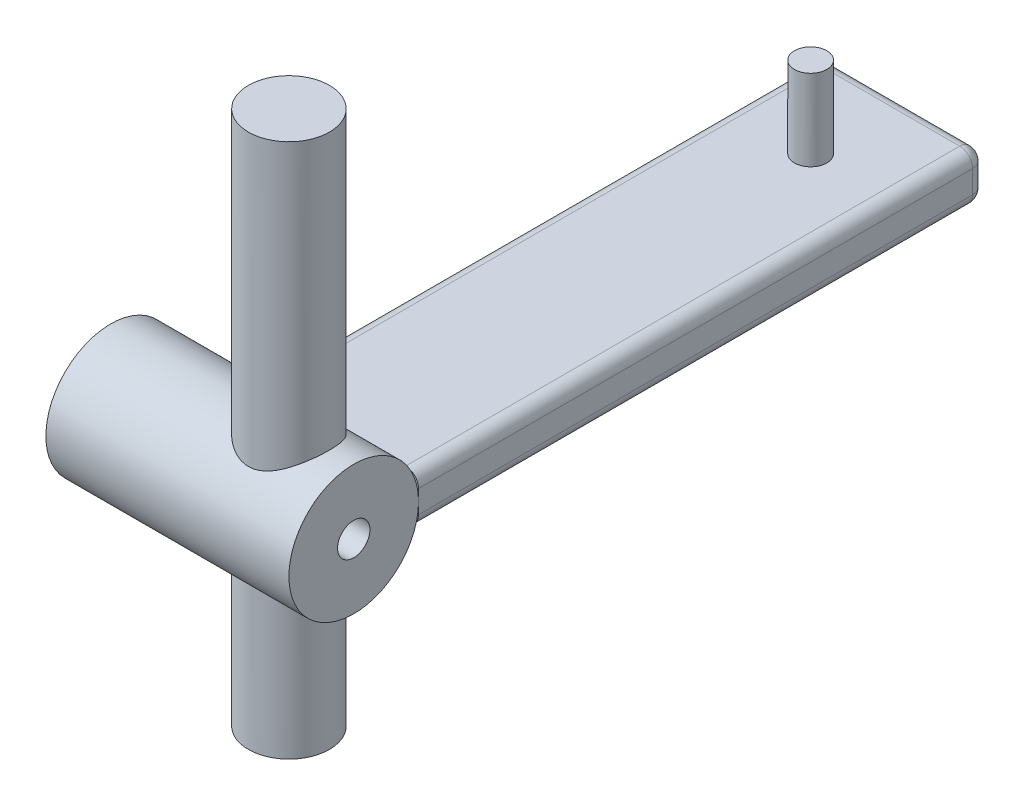
ISO-10303-21;
HEADER;
FILE_DESCRIPTION(('STEP AP214'),'2;1');
FILE_NAME('part.step','',(''),(''),'','','');
FILE_SCHEMA(('AUTOMOTIVE_DESIGN { 1 0 10303 214 1 1 1 1 }'));
ENDSEC;
DATA;
#1=APPLICATION_CONTEXT('core data for automotive mechanical design processes');
#2=APPLICATION_PROTOCOL_DEFINITION('international standard','automotive_design',2000,#1);
#3=PRODUCT_CONTEXT('',#1,'mechanical');
#4=PRODUCT('Part','Part','',(#3));
#5=PRODUCT_RELATED_PRODUCT_CATEGORY('part','',(#4));
#6=PRODUCT_DEFINITION_FORMATION('','',#4);
#7=PRODUCT_DEFINITION_CONTEXT('part definition',#1,'design');
#8=PRODUCT_DEFINITION('design','',#6,#7);
#9=PRODUCT_DEFINITION_SHAPE('','',#8);
#10=(LENGTH_UNIT() NAMED_UNIT(*) SI_UNIT(.MILLI.,.METRE.));
#11=(NAMED_UNIT(*) PLANE_ANGLE_UNIT() SI_UNIT($,.RADIAN.));
#12=(NAMED_UNIT(*) SI_UNIT($,.STERADIAN.) SOLID_ANGLE_UNIT());
#13=UNCERTAINTY_MEASURE_WITH_UNIT(LENGTH_MEASURE(1.E-05),#10,'distance_accuracy_value','');
#14=(GEOMETRIC_REPRESENTATION_CONTEXT(3) GLOBAL_UNCERTAINTY_ASSIGNED_CONTEXT((#13)) GLOBAL_UNIT_ASSIGNED_CONTEXT((#10,
#11,#12)) REPRESENTATION_CONTEXT('',''));
#15=CARTESIAN_POINT('',(0.,0.,0.));
#16=DIRECTION('',(0.,0.,1.));
#17=DIRECTION('',(1.,0.,0.));
#18=AXIS2_PLACEMENT_3D('',#15,#16,#17);
#19=CARTESIAN_POINT('',(5.,1.5,-39.));
#20=DIRECTION('',(0.,-1.,0.));
#21=DIRECTION('',(1.,0.,0.));
#22=AXIS2_PLACEMENT_3D('',#19,#20,#21);
#23=PLANE('',#22);
#24=CARTESIAN_POINT('',(10.,1.5,-33.2));
#25=DIRECTION('',(0.,-1.,0.));
#26=DIRECTION('',(1.,0.,0.));
#27=AXIS2_PLACEMENT_3D('',#24,#25,#26);
#28=CIRCLE('',#27,1.);
#29=CARTESIAN_POINT('',(11.,1.5,-33.2));
#30=VERTEX_POINT('',#29);
#31=EDGE_CURVE('E12',#30,#30,#28,.F.);
#32=ORIENTED_EDGE('',*,*,#31,.F.);
#33=EDGE_LOOP('',(#32));
#34=FACE_BOUND('',#33,.T.);
#35=DIRECTION('',(1.,0.,0.));
#36=VECTOR('',#35,1.);
#37=CARTESIAN_POINT('',(5.,1.5,-4.));
#38=LINE('',#37,#36);
#39=CARTESIAN_POINT('',(5.8,1.5,-4.));
#40=VERTEX_POINT('',#39);
#41=CARTESIAN_POINT('',(14.2,1.5,-4.));
#42=VERTEX_POINT('',#41);
#43=EDGE_CURVE('E209',#40,#42,#38,.T.);
#44=ORIENTED_EDGE('',*,*,#43,.T.);
#45=DIRECTION('',(0.,0.,1.));
#46=VECTOR('',#45,1.);
#47=CARTESIAN_POINT('',(14.2,1.50000000000001,-39.));
#48=LINE('',#47,#46);
#49=CARTESIAN_POINT('',(14.2,1.50000000000001,-38.2));
#50=VERTEX_POINT('',#49);
#51=EDGE_CURVE('E58',#42,#50,#48,.F.);
#52=ORIENTED_EDGE('',*,*,#51,.T.);
#53=DIRECTION('',(1.,0.,0.));
#54=VECTOR('',#53,1.);
#55=CARTESIAN_POINT('',(5.,1.5,-38.2));
#56=LINE('',#55,#54);
#57=CARTESIAN_POINT('',(5.8,1.5,-38.2));
#58=VERTEX_POINT('',#57);
#59=EDGE_CURVE('E63',#50,#58,#56,.F.);
#60=ORIENTED_EDGE('',*,*,#59,.T.);
#61=DIRECTION('',(0.,0.,1.));
#62=VECTOR('',#61,1.);
#63=CARTESIAN_POINT('',(5.8,1.5,-39.));
#64=LINE('',#63,#62);
#65=EDGE_CURVE('E177',#58,#40,#64,.T.);
#66=ORIENTED_EDGE('',*,*,#65,.T.);
#67=EDGE_LOOP('',(#44,#52,#60,#66));
#68=FACE_BOUND('',#67,.T.);
#69=ADVANCED_FACE('F43',(#34,#68),#23,.F.);
#70=CARTESIAN_POINT('',(15.,1.50000000000001,-39.));
#71=DIRECTION('',(-1.,0.,0.));
#72=DIRECTION('',(0.,0.,1.));
#73=AXIS2_PLACEMENT_3D('',#70,#71,#72);
#74=PLANE('',#73);
#75=DIRECTION('',(0.,-1.,0.));
#76=VECTOR('',#75,1.);
#77=CARTESIAN_POINT('',(15.,1.5,-4.));
#78=LINE('',#77,#76);
#79=CARTESIAN_POINT('',(15.,0.700000000000001,-4.));
#80=VERTEX_POINT('',#79);
#81=CARTESIAN_POINT('',(15.,-0.7,-4.));
#82=VERTEX_POINT('',#81);
#83=EDGE_CURVE('E213',#80,#82,#78,.T.);
#84=ORIENTED_EDGE('',*,*,#83,.T.);
#85=DIRECTION('',(0.,0.,1.));
#86=VECTOR('',#85,1.);
#87=CARTESIAN_POINT('',(15.,-0.699999999999996,-39.));
#88=LINE('',#87,#86);
#89=CARTESIAN_POINT('',(15.,-0.699999999999996,-38.2));
#90=VERTEX_POINT('',#89);
#91=EDGE_CURVE('E175',#82,#90,#88,.F.);
#92=ORIENTED_EDGE('',*,*,#91,.T.);
#93=DIRECTION('',(0.,-1.,0.));
#94=VECTOR('',#93,1.);
#95=CARTESIAN_POINT('',(15.,1.50000000000001,-38.2));
#96=LINE('',#95,#94);
#97=CARTESIAN_POINT('',(15.,0.700000000000005,-38.2));
#98=VERTEX_POINT('',#97);
#99=EDGE_CURVE('E173',#90,#98,#96,.F.);
#100=ORIENTED_EDGE('',*,*,#99,.T.);
#101=DIRECTION('',(0.,0.,1.));
#102=VECTOR('',#101,1.);
#103=CARTESIAN_POINT('',(15.,0.700000000000005,-39.));
#104=LINE('',#103,#102);
#105=EDGE_CURVE('E171',#98,#80,#104,.T.);
#106=ORIENTED_EDGE('',*,*,#105,.T.);
#107=EDGE_LOOP('',(#84,#92,#100,#106));
#108=FACE_BOUND('',#107,.T.);
#109=ADVANCED_FACE('F268',(#108),#74,.F.);
#110=CARTESIAN_POINT('',(15.,-1.5,-39.));
#111=DIRECTION('',(0.,1.,0.));
#112=DIRECTION('',(-1.,0.,0.));
#113=AXIS2_PLACEMENT_3D('',#110,#111,#112);
#114=PLANE('',#113);
#115=DIRECTION('',(-1.,0.,0.));
#116=VECTOR('',#115,1.);
#117=CARTESIAN_POINT('',(15.,-1.5,-38.2));
#118=LINE('',#117,#116);
#119=CARTESIAN_POINT('',(5.8,-1.5,-38.2));
#120=VERTEX_POINT('',#119);
#121=CARTESIAN_POINT('',(14.2,-1.5,-38.2));
#122=VERTEX_POINT('',#121);
#123=EDGE_CURVE('E167',#120,#122,#118,.F.);
#124=ORIENTED_EDGE('',*,*,#123,.T.);
#125=DIRECTION('',(0.,0.,1.));
#126=VECTOR('',#125,1.);
#127=CARTESIAN_POINT('',(14.2,-1.5,-39.));
#128=LINE('',#127,#126);
#129=CARTESIAN_POINT('',(14.2,-1.5,-4.));
#130=VERTEX_POINT('',#129);
#131=EDGE_CURVE('E169',#122,#130,#128,.T.);
#132=ORIENTED_EDGE('',*,*,#131,.T.);
#133=DIRECTION('',(-1.,0.,0.));
#134=VECTOR('',#133,1.);
#135=CARTESIAN_POINT('',(15.,-1.5,-4.));
#136=LINE('',#135,#134);
#137=CARTESIAN_POINT('',(5.8,-1.5,-4.));
#138=VERTEX_POINT('',#137);
#139=EDGE_CURVE('E217',#130,#138,#136,.T.);
#140=ORIENTED_EDGE('',*,*,#139,.T.);
#141=DIRECTION('',(0.,0.,1.));
#142=VECTOR('',#141,1.);
#143=CARTESIAN_POINT('',(5.8,-1.5,-39.));
#144=LINE('',#143,#142);
#145=EDGE_CURVE('E165',#138,#120,#144,.F.);
#146=ORIENTED_EDGE('',*,*,#145,.T.);
#147=EDGE_LOOP('',(#124,#132,#140,#146));
#148=FACE_BOUND('',#147,.T.);
#149=ADVANCED_FACE('F276',(#148),#114,.F.);
#150=CARTESIAN_POINT('',(5.,-1.5,-39.));
#151=DIRECTION('',(1.,0.,0.));
#152=DIRECTION('',(0.,0.,-1.));
#153=AXIS2_PLACEMENT_3D('',#150,#151,#152);
#154=PLANE('',#153);
#155=DIRECTION('',(0.,1.,0.));
#156=VECTOR('',#155,1.);
#157=CARTESIAN_POINT('',(5.,-1.5,-38.2));
#158=LINE('',#157,#156);
#159=CARTESIAN_POINT('',(5.,0.700000000000003,-38.2));
#160=VERTEX_POINT('',#159);
#161=CARTESIAN_POINT('',(5.,-0.699999999999998,-38.2));
#162=VERTEX_POINT('',#161);
#163=EDGE_CURVE('E127',#160,#162,#158,.F.);
#164=ORIENTED_EDGE('',*,*,#163,.T.);
#165=DIRECTION('',(0.,0.,1.));
#166=VECTOR('',#165,1.);
#167=CARTESIAN_POINT('',(5.,-0.699999999999998,-39.));
#168=LINE('',#167,#166);
#169=CARTESIAN_POINT('',(5.,-0.700000000000002,-4.));
#170=VERTEX_POINT('',#169);
#171=EDGE_CURVE('E163',#162,#170,#168,.T.);
#172=ORIENTED_EDGE('',*,*,#171,.T.);
#173=DIRECTION('',(0.,1.,0.));
#174=VECTOR('',#173,1.);
#175=CARTESIAN_POINT('',(5.,-1.5,-4.));
#176=LINE('',#175,#174);
#177=CARTESIAN_POINT('',(5.,0.699999999999998,-4.));
#178=VERTEX_POINT('',#177);
#179=EDGE_CURVE('E150',#170,#178,#176,.T.);
#180=ORIENTED_EDGE('',*,*,#179,.T.);
#181=DIRECTION('',(0.,0.,1.));
#182=VECTOR('',#181,1.);
#183=CARTESIAN_POINT('',(5.,0.700000000000003,-39.));
#184=LINE('',#183,#182);
#185=EDGE_CURVE('E156',#178,#160,#184,.F.);
#186=ORIENTED_EDGE('',*,*,#185,.T.);
#187=EDGE_LOOP('',(#164,#172,#180,#186));
#188=FACE_BOUND('',#187,.T.);
#189=ADVANCED_FACE('F244',(#188),#154,.F.);
#190=CARTESIAN_POINT('',(0.,0.,-39.));
#191=DIRECTION('',(0.,0.,-1.));
#192=DIRECTION('',(-1.,0.,0.));
#193=AXIS2_PLACEMENT_3D('',#190,#191,#192);
#194=PLANE('',#193);
#195=DIRECTION('',(-1.,0.,0.));
#196=VECTOR('',#195,1.);
#197=CARTESIAN_POINT('',(5.,-0.699999999999998,-39.));
#198=LINE('',#197,#196);
#199=CARTESIAN_POINT('',(14.2,-0.699999999999996,-39.));
#200=VERTEX_POINT('',#199);
#201=CARTESIAN_POINT('',(5.8,-0.699999999999998,-39.));
#202=VERTEX_POINT('',#201);
#203=EDGE_CURVE('E154',#200,#202,#198,.T.);
#204=ORIENTED_EDGE('',*,*,#203,.T.);
#205=DIRECTION('',(0.,1.,0.));
#206=VECTOR('',#205,1.);
#207=CARTESIAN_POINT('',(5.8,1.5,-39.));
#208=LINE('',#207,#206);
#209=CARTESIAN_POINT('',(5.8,0.700000000000003,-39.));
#210=VERTEX_POINT('',#209);
#211=EDGE_CURVE('E125',#202,#210,#208,.T.);
#212=ORIENTED_EDGE('',*,*,#211,.T.);
#213=DIRECTION('',(1.,0.,0.));
#214=VECTOR('',#213,1.);
#215=CARTESIAN_POINT('',(15.,0.700000000000006,-39.));
#216=LINE('',#215,#214);
#217=CARTESIAN_POINT('',(14.2,0.700000000000005,-39.));
#218=VERTEX_POINT('',#217);
#219=EDGE_CURVE('E143',#210,#218,#216,.T.);
#220=ORIENTED_EDGE('',*,*,#219,.T.);
#221=DIRECTION('',(0.,-1.,0.));
#222=VECTOR('',#221,1.);
#223=CARTESIAN_POINT('',(14.2,-1.5,-39.));
#224=LINE('',#223,#222);
#225=EDGE_CURVE('E149',#218,#200,#224,.T.);
#226=ORIENTED_EDGE('',*,*,#225,.T.);
#227=EDGE_LOOP('',(#204,#212,#220,#226));
#228=FACE_BOUND('',#227,.T.);
#229=ADVANCED_FACE('F152',(#228),#194,.T.);
#230=CARTESIAN_POINT('',(0.,0.,-4.));
#231=DIRECTION('',(0.,0.,-1.));
#232=DIRECTION('',(-1.,0.,0.));
#233=AXIS2_PLACEMENT_3D('',#230,#231,#232);
#234=PLANE('',#233);
#235=ORIENTED_EDGE('',*,*,#139,.F.);
#236=CARTESIAN_POINT('',(14.2,-0.7,-4.));
#237=DIRECTION('',(0.,0.,-1.));
#238=DIRECTION('',(-1.,0.,0.));
#239=AXIS2_PLACEMENT_3D('',#236,#237,#238);
#240=CIRCLE('',#239,0.8);
#241=EDGE_CURVE('E51',#130,#82,#240,.F.);
#242=ORIENTED_EDGE('',*,*,#241,.T.);
#243=ORIENTED_EDGE('',*,*,#83,.F.);
#244=CARTESIAN_POINT('',(14.2,0.700000000000001,-4.));
#245=DIRECTION('',(0.,0.,-1.));
#246=DIRECTION('',(-1.,0.,0.));
#247=AXIS2_PLACEMENT_3D('',#244,#245,#246);
#248=CIRCLE('',#247,0.8);
#249=EDGE_CURVE('E185',#80,#42,#248,.F.);
#250=ORIENTED_EDGE('',*,*,#249,.T.);
#251=ORIENTED_EDGE('',*,*,#43,.F.);
#252=CARTESIAN_POINT('',(5.8,0.699999999999998,-4.));
#253=DIRECTION('',(0.,0.,-1.));
#254=DIRECTION('',(-1.,0.,0.));
#255=AXIS2_PLACEMENT_3D('',#252,#253,#254);
#256=CIRCLE('',#255,0.8);
#257=EDGE_CURVE('E181',#40,#178,#256,.F.);
#258=ORIENTED_EDGE('',*,*,#257,.T.);
#259=ORIENTED_EDGE('',*,*,#179,.F.);
#260=CARTESIAN_POINT('',(5.8,-0.700000000000002,-4.));
#261=DIRECTION('',(0.,0.,-1.));
#262=DIRECTION('',(-1.,0.,0.));
#263=AXIS2_PLACEMENT_3D('',#260,#261,#262);
#264=CIRCLE('',#263,0.8);
#265=EDGE_CURVE('E183',#170,#138,#264,.F.);
#266=ORIENTED_EDGE('',*,*,#265,.T.);
#267=EDGE_LOOP('',(#235,#242,#243,#250,#251,#258,#259,#266));
#268=FACE_BOUND('',#267,.T.);
#269=ADVANCED_FACE('F251',(#268),#234,.F.);
#270=CARTESIAN_POINT('',(14.2,-0.699999999999996,-39.));
#271=DIRECTION('',(0.,0.,1.));
#272=DIRECTION('',(0.,-1.,0.));
#273=AXIS2_PLACEMENT_3D('',#270,#271,#272);
#274=CYLINDRICAL_SURFACE('',#273,0.8);
#275=ORIENTED_EDGE('',*,*,#241,.F.);
#276=ORIENTED_EDGE('',*,*,#131,.F.);
#277=CARTESIAN_POINT('',(14.2,-0.699999999999996,-38.2));
#278=DIRECTION('',(0.,0.,-1.));
#279=DIRECTION('',(-1.,0.,0.));
#280=AXIS2_PLACEMENT_3D('',#277,#278,#279);
#281=CIRCLE('',#280,0.8);
#282=EDGE_CURVE('E207',#90,#122,#281,.T.);
#283=ORIENTED_EDGE('',*,*,#282,.F.);
#284=ORIENTED_EDGE('',*,*,#91,.F.);
#285=EDGE_LOOP('',(#275,#276,#283,#284));
#286=FACE_BOUND('',#285,.T.);
#287=ADVANCED_FACE('F45',(#286),#274,.T.);
#288=CARTESIAN_POINT('',(14.2,0.,-38.2));
#289=DIRECTION('',(0.,1.,0.));
#290=DIRECTION('',(0.,0.,1.));
#291=AXIS2_PLACEMENT_3D('',#288,#289,#290);
#292=CYLINDRICAL_SURFACE('',#291,0.8);
#293=CARTESIAN_POINT('',(14.2,0.700000000000005,-38.2));
#294=DIRECTION('',(0.,1.,0.));
#295=DIRECTION('',(0.,0.,1.));
#296=AXIS2_PLACEMENT_3D('',#293,#294,#295);
#297=CIRCLE('',#296,0.8);
#298=EDGE_CURVE('E202',#98,#218,#297,.T.);
#299=ORIENTED_EDGE('',*,*,#298,.F.);
#300=ORIENTED_EDGE('',*,*,#99,.F.);
#301=CARTESIAN_POINT('',(14.2,-0.699999999999996,-38.2));
#302=DIRECTION('',(0.,-1.,0.));
#303=DIRECTION('',(0.,0.,-1.));
#304=AXIS2_PLACEMENT_3D('',#301,#302,#303);
#305=CIRCLE('',#304,0.8);
#306=EDGE_CURVE('E205',#200,#90,#305,.T.);
#307=ORIENTED_EDGE('',*,*,#306,.F.);
#308=ORIENTED_EDGE('',*,*,#225,.F.);
#309=EDGE_LOOP('',(#299,#300,#307,#308));
#310=FACE_BOUND('',#309,.T.);
#311=ADVANCED_FACE('F228',(#310),#292,.T.);
#312=CARTESIAN_POINT('',(14.2,0.700000000000005,-39.));
#313=DIRECTION('',(0.,0.,1.));
#314=DIRECTION('',(0.,-1.,0.));
#315=AXIS2_PLACEMENT_3D('',#312,#313,#314);
#316=CYLINDRICAL_SURFACE('',#315,0.8);
#317=ORIENTED_EDGE('',*,*,#249,.F.);
#318=ORIENTED_EDGE('',*,*,#105,.F.);
#319=CARTESIAN_POINT('',(14.2,0.700000000000005,-38.2));
#320=DIRECTION('',(0.,0.,-1.));
#321=DIRECTION('',(-1.,0.,0.));
#322=AXIS2_PLACEMENT_3D('',#319,#320,#321);
#323=CIRCLE('',#322,0.8);
#324=EDGE_CURVE('E199',#50,#98,#323,.T.);
#325=ORIENTED_EDGE('',*,*,#324,.F.);
#326=ORIENTED_EDGE('',*,*,#51,.F.);
#327=EDGE_LOOP('',(#317,#318,#325,#326));
#328=FACE_BOUND('',#327,.T.);
#329=ADVANCED_FACE('F256',(#328),#316,.T.);
#330=CARTESIAN_POINT('',(14.2,-0.699999999999996,-38.2));
#331=DIRECTION('',(1.,0.,0.));
#332=DIRECTION('',(0.,0.,-1.));
#333=AXIS2_PLACEMENT_3D('',#330,#331,#332);
#334=SPHERICAL_SURFACE('',#333,0.8);
#335=ORIENTED_EDGE('',*,*,#306,.T.);
#336=ORIENTED_EDGE('',*,*,#282,.T.);
#337=CARTESIAN_POINT('',(14.2,-0.699999999999996,-38.2));
#338=DIRECTION('',(1.,0.,0.));
#339=DIRECTION('',(0.,0.,-1.));
#340=AXIS2_PLACEMENT_3D('',#337,#338,#339);
#341=CIRCLE('',#340,0.8);
#342=EDGE_CURVE('E196',#200,#122,#341,.F.);
#343=ORIENTED_EDGE('',*,*,#342,.F.);
#344=EDGE_LOOP('',(#335,#336,#343));
#345=FACE_BOUND('',#344,.T.);
#346=ADVANCED_FACE('F229',(#345),#334,.T.);
#347=CARTESIAN_POINT('',(14.2,0.700000000000005,-38.2));
#348=DIRECTION('',(1.,0.,0.));
#349=DIRECTION('',(0.,0.,-1.));
#350=AXIS2_PLACEMENT_3D('',#347,#348,#349);
#351=SPHERICAL_SURFACE('',#350,0.8);
#352=ORIENTED_EDGE('',*,*,#324,.T.);
#353=ORIENTED_EDGE('',*,*,#298,.T.);
#354=CARTESIAN_POINT('',(14.2,0.700000000000005,-38.2));
#355=DIRECTION('',(1.,0.,0.));
#356=DIRECTION('',(0.,0.,-1.));
#357=AXIS2_PLACEMENT_3D('',#354,#355,#356);
#358=CIRCLE('',#357,0.8);
#359=EDGE_CURVE('E146',#50,#218,#358,.F.);
#360=ORIENTED_EDGE('',*,*,#359,.F.);
#361=EDGE_LOOP('',(#352,#353,#360));
#362=FACE_BOUND('',#361,.T.);
#363=ADVANCED_FACE('F258',(#362),#351,.T.);
#364=CARTESIAN_POINT('',(5.8,-0.699999999999998,-39.));
#365=DIRECTION('',(0.,0.,1.));
#366=DIRECTION('',(0.,-1.,0.));
#367=AXIS2_PLACEMENT_3D('',#364,#365,#366);
#368=CYLINDRICAL_SURFACE('',#367,0.8);
#369=ORIENTED_EDGE('',*,*,#265,.F.);
#370=ORIENTED_EDGE('',*,*,#171,.F.);
#371=CARTESIAN_POINT('',(5.8,-0.699999999999998,-38.2));
#372=DIRECTION('',(0.,0.,-1.));
#373=DIRECTION('',(-1.,0.,0.));
#374=AXIS2_PLACEMENT_3D('',#371,#372,#373);
#375=CIRCLE('',#374,0.8);
#376=EDGE_CURVE('E192',#120,#162,#375,.T.);
#377=ORIENTED_EDGE('',*,*,#376,.F.);
#378=ORIENTED_EDGE('',*,*,#145,.F.);
#379=EDGE_LOOP('',(#369,#370,#377,#378));
#380=FACE_BOUND('',#379,.T.);
#381=ADVANCED_FACE('F241',(#380),#368,.T.);
#382=CARTESIAN_POINT('',(0.,-0.699999999999999,-38.2));
#383=DIRECTION('',(1.,0.,0.));
#384=DIRECTION('',(0.,1.,0.));
#385=AXIS2_PLACEMENT_3D('',#382,#383,#384);
#386=CYLINDRICAL_SURFACE('',#385,0.8);
#387=ORIENTED_EDGE('',*,*,#342,.T.);
#388=ORIENTED_EDGE('',*,*,#123,.F.);
#389=CARTESIAN_POINT('',(5.8,-0.699999999999998,-38.2));
#390=DIRECTION('',(-1.,0.,0.));
#391=DIRECTION('',(0.,0.,1.));
#392=AXIS2_PLACEMENT_3D('',#389,#390,#391);
#393=CIRCLE('',#392,0.8);
#394=EDGE_CURVE('E140',#202,#120,#393,.T.);
#395=ORIENTED_EDGE('',*,*,#394,.F.);
#396=ORIENTED_EDGE('',*,*,#203,.F.);
#397=EDGE_LOOP('',(#387,#388,#395,#396));
#398=FACE_BOUND('',#397,.T.);
#399=ADVANCED_FACE('F232',(#398),#386,.T.);
#400=CARTESIAN_POINT('',(0.,0.700000000000001,-38.2));
#401=DIRECTION('',(-1.,0.,0.));
#402=DIRECTION('',(0.,-1.,0.));
#403=AXIS2_PLACEMENT_3D('',#400,#401,#402);
#404=CYLINDRICAL_SURFACE('',#403,0.8);
#405=ORIENTED_EDGE('',*,*,#359,.T.);
#406=ORIENTED_EDGE('',*,*,#219,.F.);
#407=CARTESIAN_POINT('',(5.8,0.700000000000003,-38.2));
#408=DIRECTION('',(-1.,0.,0.));
#409=DIRECTION('',(0.,0.,1.));
#410=AXIS2_PLACEMENT_3D('',#407,#408,#409);
#411=CIRCLE('',#410,0.8);
#412=EDGE_CURVE('E134',#58,#210,#411,.T.);
#413=ORIENTED_EDGE('',*,*,#412,.F.);
#414=ORIENTED_EDGE('',*,*,#59,.F.);
#415=EDGE_LOOP('',(#405,#406,#413,#414));
#416=FACE_BOUND('',#415,.T.);
#417=ADVANCED_FACE('F144',(#416),#404,.T.);
#418=CARTESIAN_POINT('',(5.8,0.700000000000003,-39.));
#419=DIRECTION('',(0.,0.,1.));
#420=DIRECTION('',(0.,-1.,0.));
#421=AXIS2_PLACEMENT_3D('',#418,#419,#420);
#422=CYLINDRICAL_SURFACE('',#421,0.8);
#423=ORIENTED_EDGE('',*,*,#257,.F.);
#424=ORIENTED_EDGE('',*,*,#65,.F.);
#425=CARTESIAN_POINT('',(5.8,0.700000000000003,-38.2));
#426=DIRECTION('',(0.,0.,-1.));
#427=DIRECTION('',(-1.,0.,0.));
#428=AXIS2_PLACEMENT_3D('',#425,#426,#427);
#429=CIRCLE('',#428,0.8);
#430=EDGE_CURVE('E138',#160,#58,#429,.T.);
#431=ORIENTED_EDGE('',*,*,#430,.F.);
#432=ORIENTED_EDGE('',*,*,#185,.F.);
#433=EDGE_LOOP('',(#423,#424,#431,#432));
#434=FACE_BOUND('',#433,.T.);
#435=ADVANCED_FACE('F248',(#434),#422,.T.);
#436=CARTESIAN_POINT('',(5.8,-0.699999999999998,-38.2));
#437=DIRECTION('',(0.,-1.,0.));
#438=DIRECTION('',(0.,0.,-1.));
#439=AXIS2_PLACEMENT_3D('',#436,#437,#438);
#440=SPHERICAL_SURFACE('',#439,0.8);
#441=ORIENTED_EDGE('',*,*,#394,.T.);
#442=ORIENTED_EDGE('',*,*,#376,.T.);
#443=CARTESIAN_POINT('',(5.8,-0.699999999999998,-38.2));
#444=DIRECTION('',(0.,-1.,0.));
#445=DIRECTION('',(0.,0.,-1.));
#446=AXIS2_PLACEMENT_3D('',#443,#444,#445);
#447=CIRCLE('',#446,0.8);
#448=EDGE_CURVE('E130',#202,#162,#447,.F.);
#449=ORIENTED_EDGE('',*,*,#448,.F.);
#450=EDGE_LOOP('',(#441,#442,#449));
#451=FACE_BOUND('',#450,.T.);
#452=ADVANCED_FACE('F236',(#451),#440,.T.);
#453=CARTESIAN_POINT('',(5.8,0.700000000000003,-38.2));
#454=DIRECTION('',(0.,1.,0.));
#455=DIRECTION('',(0.,0.,1.));
#456=AXIS2_PLACEMENT_3D('',#453,#454,#455);
#457=SPHERICAL_SURFACE('',#456,0.8);
#458=ORIENTED_EDGE('',*,*,#430,.T.);
#459=ORIENTED_EDGE('',*,*,#412,.T.);
#460=CARTESIAN_POINT('',(5.8,0.700000000000003,-38.2));
#461=DIRECTION('',(0.,1.,0.));
#462=DIRECTION('',(0.,0.,1.));
#463=AXIS2_PLACEMENT_3D('',#460,#461,#462);
#464=CIRCLE('',#463,0.8);
#465=EDGE_CURVE('E121',#160,#210,#464,.F.);
#466=ORIENTED_EDGE('',*,*,#465,.F.);
#467=EDGE_LOOP('',(#458,#459,#466));
#468=FACE_BOUND('',#467,.T.);
#469=ADVANCED_FACE('F136',(#468),#457,.T.);
#470=CARTESIAN_POINT('',(5.8,0.,-38.2));
#471=DIRECTION('',(0.,-1.,0.));
#472=DIRECTION('',(0.,0.,-1.));
#473=AXIS2_PLACEMENT_3D('',#470,#471,#472);
#474=CYLINDRICAL_SURFACE('',#473,0.8);
#475=ORIENTED_EDGE('',*,*,#448,.T.);
#476=ORIENTED_EDGE('',*,*,#163,.F.);
#477=ORIENTED_EDGE('',*,*,#465,.T.);
#478=ORIENTED_EDGE('',*,*,#211,.F.);
#479=EDGE_LOOP('',(#475,#476,#477,#478));
#480=FACE_BOUND('',#479,.T.);
#481=ADVANCED_FACE('F123',(#480),#474,.T.);
#482=CARTESIAN_POINT('',(10.,6.5,-33.2));
#483=DIRECTION('',(0.,-1.,0.));
#484=DIRECTION('',(1.,0.,0.));
#485=AXIS2_PLACEMENT_3D('',#482,#483,#484);
#486=CYLINDRICAL_SURFACE('',#485,1.);
#487=CARTESIAN_POINT('',(10.,6.5,-33.2));
#488=DIRECTION('',(0.,1.,0.));
#489=DIRECTION('',(-1.,0.,0.));
#490=AXIS2_PLACEMENT_3D('',#487,#488,#489);
#491=CIRCLE('',#490,1.);
#492=CARTESIAN_POINT('',(9.,6.5,-33.2));
#493=VERTEX_POINT('',#492);
#494=EDGE_CURVE('E131',#493,#493,#491,.T.);
#495=ORIENTED_EDGE('',*,*,#494,.F.);
#496=EDGE_LOOP('',(#495));
#497=FACE_BOUND('',#496,.T.);
#498=ORIENTED_EDGE('',*,*,#31,.T.);
#499=EDGE_LOOP('',(#498));
#500=FACE_BOUND('',#499,.T.);
#501=ADVANCED_FACE('F284',(#497,#500),#486,.T.);
#502=CARTESIAN_POINT('',(10.,6.5,-33.2));
#503=DIRECTION('',(0.,1.,0.));
#504=DIRECTION('',(-1.,0.,0.));
#505=AXIS2_PLACEMENT_3D('',#502,#503,#504);
#506=PLANE('',#505);
#507=ORIENTED_EDGE('',*,*,#494,.T.);
#508=EDGE_LOOP('',(#507));
#509=FACE_BOUND('',#508,.T.);
#510=ADVANCED_FACE('F322',(#509),#506,.T.);
#511=CLOSED_SHELL('',(#69,#109,#149,#189,#229,#269,#287,#311,#329,#346,#363,#381,#399,#417,#435,
#452,#469,#481,#501,#510));
#512=MANIFOLD_SOLID_BREP('B2',#511);
#513=CARTESIAN_POINT('',(15.,0.,0.));
#514=DIRECTION('',(-1.,0.,0.));
#515=DIRECTION('',(0.,0.,1.));
#516=AXIS2_PLACEMENT_3D('',#513,#514,#515);
#517=CYLINDRICAL_SURFACE('',#516,4.);
#518=CARTESIAN_POINT('',(15.,0.,0.));
#519=DIRECTION('',(1.,0.,0.));
#520=DIRECTION('',(0.,0.,-1.));
#521=AXIS2_PLACEMENT_3D('',#518,#519,#520);
#522=CIRCLE('',#521,4.);
#523=CARTESIAN_POINT('',(15.,0.,-4.));
#524=VERTEX_POINT('',#523);
#525=EDGE_CURVE('E444',#524,#524,#522,.T.);
#526=ORIENTED_EDGE('',*,*,#525,.F.);
#527=EDGE_LOOP('',(#526));
#528=FACE_BOUND('',#527,.T.);
#529=CARTESIAN_POINT('',(0.,0.,0.));
#530=DIRECTION('',(1.,0.,0.));
#531=DIRECTION('',(0.,0.,-1.));
#532=AXIS2_PLACEMENT_3D('',#529,#530,#531);
#533=CIRCLE('',#532,4.);
#534=CARTESIAN_POINT('',(0.,0.,-4.));
#535=VERTEX_POINT('',#534);
#536=EDGE_CURVE('E440',#535,#535,#533,.T.);
#537=ORIENTED_EDGE('',*,*,#536,.T.);
#538=EDGE_LOOP('',(#537));
#539=FACE_BOUND('',#538,.T.);
#540=CARTESIAN_POINT('',(11.,3.1224989991992,2.5));
#541=CARTESIAN_POINT('',(11.0621567514455,3.12249991555421,2.4999994109714));
#542=CARTESIAN_POINT('',(11.1243259466708,3.12436490733916,2.49767581942174));
#543=CARTESIAN_POINT('',(11.2481171795477,3.13172923119025,2.48843349840857));
#544=CARTESIAN_POINT('',(11.3097388732571,3.13723070381364,2.48151206248434));
#545=CARTESIAN_POINT('',(11.4932260477437,3.15888953558504,2.45397595058365));
#546=CARTESIAN_POINT('',(11.613548331189,3.18020036271142,2.4265899094646));
#547=CARTESIAN_POINT('',(11.8455981978782,3.23299770760367,2.35576217141198));
#548=CARTESIAN_POINT('',(11.9573904150551,3.26439575383209,2.31245961359202));
#549=CARTESIAN_POINT('',(12.1720085253341,3.33366000884439,2.21143916430899));
#550=CARTESIAN_POINT('',(12.2748341737531,3.37152639405534,2.15372087963018));
#551=CARTESIAN_POINT('',(12.4837339813037,3.45559225121876,2.01647682425578));
#552=CARTESIAN_POINT('',(12.5883933250045,3.50222814511578,1.93506425666949));
#553=CARTESIAN_POINT('',(12.7837615516238,3.59505503533367,1.75662526657432));
#554=CARTESIAN_POINT('',(12.8744582799536,3.64124561158438,1.65958538899782));
#555=CARTESIAN_POINT('',(13.0502202981727,3.73459524771314,1.43833990582854));
#556=CARTESIAN_POINT('',(13.1332861844504,3.78119887781505,1.31226934259652));
#557=CARTESIAN_POINT('',(13.2405451547362,3.84307251838774,1.11163395543429));
#558=CARTESIAN_POINT('',(13.2734151383331,3.86236283092052,1.04281240974104));
#559=CARTESIAN_POINT('',(13.3329546853633,3.89770436975436,0.901758767615551));
#560=CARTESIAN_POINT('',(13.3596285310384,3.91375783207118,0.829529068393799));
#561=CARTESIAN_POINT('',(13.4039838152563,3.94066759113823,0.689700297916579));
#562=CARTESIAN_POINT('',(13.4223019765181,3.95188535984466,0.622371981278591));
#563=CARTESIAN_POINT('',(13.4533022863134,3.97096241909162,0.485997575898811));
#564=CARTESIAN_POINT('',(13.4659876892162,3.97882364879721,0.416952503441685));
#565=CARTESIAN_POINT('',(13.4855137976345,3.99095470334737,0.277765449857176));
#566=CARTESIAN_POINT('',(13.4923581165134,3.99522674847834,0.207624174243907));
#567=CARTESIAN_POINT('',(13.5000992133892,4.00006125072438,0.0669114466599402));
#568=CARTESIAN_POINT('',(13.5009966759634,4.00062413482248,-0.00365995486027784));
#569=CARTESIAN_POINT('',(13.4952746264528,3.99704479619503,-0.196045081555537));
#570=CARTESIAN_POINT('',(13.4826934969211,3.98917040897436,-0.317681845488535));
#571=CARTESIAN_POINT('',(13.4402697820339,3.96290903275931,-0.556636494620255));
#572=CARTESIAN_POINT('',(13.4104258920264,3.94452124920478,-0.673954052677426));
#573=CARTESIAN_POINT('',(13.3347914407167,3.89876170711609,-0.901771991763867));
#574=CARTESIAN_POINT('',(13.2889600804289,3.87136697381047,-1.01225407159606));
#575=CARTESIAN_POINT('',(13.1830627610157,3.80971291751354,-1.22404012071223));
#576=CARTESIAN_POINT('',(13.1229935589364,3.77545203089318,-1.32534199174245));
#577=CARTESIAN_POINT('',(12.9819435830763,3.69786441247167,-1.52942649744659));
#578=CARTESIAN_POINT('',(12.8992907233095,3.65394006381521,-1.63082454612907));
#579=CARTESIAN_POINT('',(12.7197352627929,3.56390927740507,-1.81919733573063));
#580=CARTESIAN_POINT('',(12.622811953616,3.51779973570409,-1.90615071842624));
#581=CARTESIAN_POINT('',(12.4025887468265,3.42142883464466,-2.07470887167909));
#582=CARTESIAN_POINT('',(12.2774972366419,3.37141162686597,-2.15413229677844));
#583=CARTESIAN_POINT('',(12.0127077626986,3.28028278192382,-2.29052307550563));
#584=CARTESIAN_POINT('',(11.8730373125469,3.23915480386931,-2.34753179448504));
#585=CARTESIAN_POINT('',(11.6204611938938,3.18183753131763,-2.42437133527931));
#586=CARTESIAN_POINT('',(11.5101780747865,3.16193408602513,-2.45003683445404));
#587=CARTESIAN_POINT('',(11.2857696224401,3.13358277759547,-2.48620337073091));
#588=CARTESIAN_POINT('',(11.1716497573432,3.12511926504439,-2.49672512520811));
#589=CARTESIAN_POINT('',(10.9425426394976,3.12092267030677,-2.50197072095181));
#590=CARTESIAN_POINT('',(10.8275539995215,3.12521876170185,-2.49665835896695));
#591=CARTESIAN_POINT('',(10.6004388356815,3.14592085836188,-2.47051466367814));
#592=CARTESIAN_POINT('',(10.4883147616288,3.16233689222906,-2.44967047849126));
#593=CARTESIAN_POINT('',(10.2715632405743,3.20460120797143,-2.39409874195038));
#594=CARTESIAN_POINT('',(10.1668426841057,3.23028954367817,-2.35960571424758));
#595=CARTESIAN_POINT('',(9.96442530010621,3.28831148388749,-2.27804893702243));
#596=CARTESIAN_POINT('',(9.86673098112203,3.32064744602081,-2.23098072583747));
#597=CARTESIAN_POINT('',(9.66138805833681,3.39574401285203,-2.11530798730694));
#598=CARTESIAN_POINT('',(9.55538547269823,3.43931724293015,-2.04430931160544));
#599=CARTESIAN_POINT('',(9.35562933934573,3.52787943213338,-1.88737868921489));
#600=CARTESIAN_POINT('',(9.26188867875766,3.57286982004467,-1.8014312490262));
#601=CARTESIAN_POINT('',(9.07403592935904,3.66766209459505,-1.60076932492121));
#602=CARTESIAN_POINT('',(8.98227260151509,3.71707933883201,-1.48365201617177));
#603=CARTESIAN_POINT('',(8.81985298528028,3.80768973398606,-1.23256787407809));
#604=CARTESIAN_POINT('',(8.74918680487308,3.84888673619009,-1.09860897940974));
#605=CARTESIAN_POINT('',(8.66341893202501,3.89988966499776,-0.89193080465508));
#606=CARTESIAN_POINT('',(8.63870255604872,3.91477055097245,-0.824318196039419));
#607=CARTESIAN_POINT('',(8.59506172326772,3.94124643918619,-0.686640792876421));
#608=CARTESIAN_POINT('',(8.57613391384908,3.95284334314805,-0.616577444051133));
#609=CARTESIAN_POINT('',(8.54439416986074,3.9723851203995,-0.474639231464261));
#610=CARTESIAN_POINT('',(8.53157690048357,3.98033317908836,-0.402766005755505));
#611=CARTESIAN_POINT('',(8.5122608277071,3.99234168343343,-0.257881807142459));
#612=CARTESIAN_POINT('',(8.50576097906921,3.99640277220024,-0.184871024482533));
#613=CARTESIAN_POINT('',(8.49692848449289,4.00191521492706,0.0131102774248941));
#614=CARTESIAN_POINT('',(8.50073420709059,3.99952706123947,0.138539079205451));
#615=CARTESIAN_POINT('',(8.52691758954553,3.98321975018363,0.386583137102133));
#616=CARTESIAN_POINT('',(8.5492944066788,3.96930111604857,0.509198520626833));
#617=CARTESIAN_POINT('',(8.61032241554611,3.93192083384285,0.744080605483852));
#618=CARTESIAN_POINT('',(8.64838207356467,3.90880701054803,0.856558752631814));
#619=CARTESIAN_POINT('',(8.73911946244348,3.85489971248843,1.07343034721918));
#620=CARTESIAN_POINT('',(8.7917996595672,3.82410494215309,1.17782242685803));
#621=CARTESIAN_POINT('',(8.91632127871996,3.75350673935648,1.38731297754798));
#622=CARTESIAN_POINT('',(8.9895839907575,3.71310001864657,1.4913601218378));
#623=CARTESIAN_POINT('',(9.1501532325141,3.62867283985206,1.68643334934803));
#624=CARTESIAN_POINT('',(9.23747560883428,3.58464833191203,1.77744451843681));
#625=CARTESIAN_POINT('',(9.43823251506187,3.49000828219718,1.95744716561589));
#626=CARTESIAN_POINT('',(9.55361661257142,3.43935738427104,2.04425661250064));
#627=CARTESIAN_POINT('',(9.79928940975976,3.34349647457112,2.19754648509905));
#628=CARTESIAN_POINT('',(9.92956981115252,3.2982834620419,2.26403815415028));
#629=CARTESIAN_POINT('',(10.1728053007849,3.22859539780091,2.36198229412841));
#630=CARTESIAN_POINT('',(10.2832705721536,3.20174639338769,2.3979245857683));
#631=CARTESIAN_POINT('',(10.5099393430018,3.1587835810451,2.45425618419746));
#632=CARTESIAN_POINT('',(10.6261234197997,3.14263581150428,2.47469472410168));
#633=CARTESIAN_POINT('',(10.7860599946461,3.12952857640607,2.49119847139522));
#634=CARTESIAN_POINT('',(10.8287255257087,3.1268999430677,2.4944943383796));
#635=CARTESIAN_POINT('',(10.9142586989517,3.12338461939862,2.49889558125807));
#636=CARTESIAN_POINT('',(10.9571263892434,3.12249836712871,2.50000040629188));
#637=CARTESIAN_POINT('',(11.,3.1224989991992,2.5));
#638=B_SPLINE_CURVE_WITH_KNOTS('',3,(#540,#541,#542,#543,#544,#545,#546,#547,#548,#549,#550,
#551,#552,#553,#554,#555,#556,#557,#558,#559,#560,#561,#562,#563,#564,#565,#566,#567,#568,#569,
#570,#571,#572,#573,#574,#575,#576,#577,#578,#579,#580,#581,#582,#583,#584,#585,#586,#587,#588,
#589,#590,#591,#592,#593,#594,#595,#596,#597,#598,#599,#600,#601,#602,#603,#604,#605,#606,#607,
#608,#609,#610,#611,#612,#613,#614,#615,#616,#617,#618,#619,#620,#621,#622,#623,#624,#625,#626,
#627,#628,#629,#630,#631,#632,#633,#634,#635,#636,#637),.UNSPECIFIED.,.T.,.F.,(4,2,2,2,2,2,2,2,
2,2,2,2,2,2,2,2,2,2,2,2,2,2,2,2,2,2,2,2,2,2,2,2,2,2,2,2,2,2,2,2,2,2,2,2,2,2,2,2,4),(0.,
0.186415315858459,0.372940459994496,0.746478880764687,1.11682668423133,1.48718459072605,
1.90722798685071,2.32763499192879,2.7987602926597,3.03445880867314,3.26999394209509,
3.48170145743206,3.69328649746504,3.90474055342595,4.11617026725867,4.48184709708114,
4.84755156693919,5.21419620193005,5.58092442797435,5.99329080205308,6.40626158573465,
6.87316206383506,7.33919680735487,7.68265621505467,8.02564530559509,8.36941921026408,
8.71347788865091,9.05186495232127,9.39037223519201,9.79332737765188,10.1967026751544,
10.6647326786671,11.1325428866819,11.3527929661039,11.5729152387447,11.7928449800804,
12.0127383271002,12.3871595324234,12.7615637480926,13.1229788842094,13.4844550226785,
13.8834503840959,14.2828986410983,14.7399238503459,15.1966956936287,15.5530255473292,
15.9082190611887,16.0367696833385,16.1653526209168),.UNSPECIFIED.);
#639=CARTESIAN_POINT('',(11.,3.1224989991992,2.5));
#640=VERTEX_POINT('',#639);
#641=EDGE_CURVE('E455',#640,#640,#638,.T.);
#642=ORIENTED_EDGE('',*,*,#641,.F.);
#643=EDGE_LOOP('',(#642));
#644=FACE_BOUND('',#643,.T.);
#645=CARTESIAN_POINT('',(11.,-3.1224989991992,2.5));
#646=CARTESIAN_POINT('',(10.9378432485545,-3.12249991555421,2.4999994109714));
#647=CARTESIAN_POINT('',(10.8756740533292,-3.12436490733917,2.49767581942174));
#648=CARTESIAN_POINT('',(10.7518828204523,-3.13172923119025,2.48843349840857));
#649=CARTESIAN_POINT('',(10.6902611267429,-3.13723070381364,2.48151206248434));
#650=CARTESIAN_POINT('',(10.5067739522563,-3.15888953558504,2.45397595058365));
#651=CARTESIAN_POINT('',(10.386451668811,-3.18020036271142,2.42658990946459));
#652=CARTESIAN_POINT('',(10.1544018021218,-3.23299770760367,2.35576217141198));
#653=CARTESIAN_POINT('',(10.0426095849449,-3.26439575383209,2.31245961359202));
#654=CARTESIAN_POINT('',(9.82799147466594,-3.33366000884439,2.21143916430899));
#655=CARTESIAN_POINT('',(9.72516582624691,-3.37152639405534,2.15372087963018));
#656=CARTESIAN_POINT('',(9.51626601869634,-3.45559225121876,2.01647682425578));
#657=CARTESIAN_POINT('',(9.41160667499548,-3.50222814511578,1.93506425666949));
#658=CARTESIAN_POINT('',(9.2162384483762,-3.59505503533367,1.75662526657432));
#659=CARTESIAN_POINT('',(9.12554172004638,-3.64124561158438,1.65958538899782));
#660=CARTESIAN_POINT('',(8.94977970182732,-3.73459524771314,1.43833990582854));
#661=CARTESIAN_POINT('',(8.86671381554956,-3.78119887781505,1.31226934259652));
#662=CARTESIAN_POINT('',(8.75945484526376,-3.84307251838774,1.11163395543429));
#663=CARTESIAN_POINT('',(8.72658486166689,-3.86236283092052,1.04281240974104));
#664=CARTESIAN_POINT('',(8.66704531463672,-3.89770436975436,0.901758767615551));
#665=CARTESIAN_POINT('',(8.64037146896158,-3.91375783207118,0.829529068393799));
#666=CARTESIAN_POINT('',(8.59601618474372,-3.94066759113823,0.689700297916578));
#667=CARTESIAN_POINT('',(8.57769802348189,-3.95188535984466,0.62237198127859));
#668=CARTESIAN_POINT('',(8.54669771368664,-3.97096241909162,0.485997575898809));
#669=CARTESIAN_POINT('',(8.53401231078379,-3.97882364879721,0.416952503441684));
#670=CARTESIAN_POINT('',(8.51448620236546,-3.99095470334737,0.277765449857175));
#671=CARTESIAN_POINT('',(8.50764188348659,-3.99522674847834,0.207624174243907));
#672=CARTESIAN_POINT('',(8.49990078661077,-4.00006125072438,0.0669114466599394));
#673=CARTESIAN_POINT('',(8.49900332403665,-4.00062413482248,-0.0036599548602787));
#674=CARTESIAN_POINT('',(8.50472537354725,-3.99704479619503,-0.196045081555538));
#675=CARTESIAN_POINT('',(8.51730650307888,-3.98917040897436,-0.317681845488536));
#676=CARTESIAN_POINT('',(8.55973021796612,-3.96290903275931,-0.556636494620256));
#677=CARTESIAN_POINT('',(8.58957410797362,-3.94452124920477,-0.673954052677426));
#678=CARTESIAN_POINT('',(8.66520855928325,-3.89876170711609,-0.901771991763868));
#679=CARTESIAN_POINT('',(8.71103991957106,-3.87136697381047,-1.01225407159607));
#680=CARTESIAN_POINT('',(8.81693723898429,-3.80971291751354,-1.22404012071223));
#681=CARTESIAN_POINT('',(8.87700644106365,-3.77545203089318,-1.32534199174245));
#682=CARTESIAN_POINT('',(9.01805641692367,-3.69786441247167,-1.52942649744659));
#683=CARTESIAN_POINT('',(9.10070927669048,-3.65394006381521,-1.63082454612907));
#684=CARTESIAN_POINT('',(9.28026473720707,-3.56390927740507,-1.81919733573063));
#685=CARTESIAN_POINT('',(9.37718804638397,-3.51779973570409,-1.90615071842624));
#686=CARTESIAN_POINT('',(9.59741125317348,-3.42142883464466,-2.07470887167909));
#687=CARTESIAN_POINT('',(9.72250276335808,-3.37141162686597,-2.15413229677844));
#688=CARTESIAN_POINT('',(9.9872922373014,-3.28028278192382,-2.29052307550563));
#689=CARTESIAN_POINT('',(10.1269626874531,-3.23915480386931,-2.34753179448504));
#690=CARTESIAN_POINT('',(10.3795388061062,-3.18183753131763,-2.42437133527931));
#691=CARTESIAN_POINT('',(10.4898219252135,-3.16193408602513,-2.45003683445404));
#692=CARTESIAN_POINT('',(10.7142303775599,-3.13358277759547,-2.48620337073091));
#693=CARTESIAN_POINT('',(10.8283502426568,-3.12511926504439,-2.49672512520811));
#694=CARTESIAN_POINT('',(11.0574573605024,-3.12092267030677,-2.50197072095181));
#695=CARTESIAN_POINT('',(11.1724460004785,-3.12521876170185,-2.49665835896695));
#696=CARTESIAN_POINT('',(11.3995611643185,-3.14592085836188,-2.47051466367814));
#697=CARTESIAN_POINT('',(11.5116852383712,-3.16233689222906,-2.44967047849126));
#698=CARTESIAN_POINT('',(11.7284367594257,-3.20460120797143,-2.39409874195038));
#699=CARTESIAN_POINT('',(11.8331573158943,-3.23028954367817,-2.35960571424758));
#700=CARTESIAN_POINT('',(12.0355746998938,-3.28831148388749,-2.27804893702243));
#701=CARTESIAN_POINT('',(12.133269018878,-3.32064744602081,-2.23098072583747));
#702=CARTESIAN_POINT('',(12.3386119416632,-3.39574401285203,-2.11530798730694));
#703=CARTESIAN_POINT('',(12.4446145273018,-3.43931724293015,-2.04430931160544));
#704=CARTESIAN_POINT('',(12.6443706606543,-3.52787943213338,-1.8873786892149));
#705=CARTESIAN_POINT('',(12.7381113212423,-3.57286982004467,-1.8014312490262));
#706=CARTESIAN_POINT('',(12.925964070641,-3.66766209459504,-1.60076932492121));
#707=CARTESIAN_POINT('',(13.0177273984849,-3.71707933883201,-1.48365201617177));
#708=CARTESIAN_POINT('',(13.1801470147197,-3.80768973398606,-1.2325678740781));
#709=CARTESIAN_POINT('',(13.2508131951269,-3.84888673619009,-1.09860897940974));
#710=CARTESIAN_POINT('',(13.336581067975,-3.89988966499776,-0.891930804655084));
#711=CARTESIAN_POINT('',(13.3612974439513,-3.91477055097245,-0.824318196039423));
#712=CARTESIAN_POINT('',(13.4049382767323,-3.94124643918619,-0.686640792876425));
#713=CARTESIAN_POINT('',(13.4238660861509,-3.95284334314805,-0.616577444051137));
#714=CARTESIAN_POINT('',(13.4556058301393,-3.9723851203995,-0.474639231464264));
#715=CARTESIAN_POINT('',(13.4684230995164,-3.98033317908836,-0.402766005755507));
#716=CARTESIAN_POINT('',(13.4877391722929,-3.99234168343343,-0.257881807142461));
#717=CARTESIAN_POINT('',(13.4942390209308,-3.99640277220024,-0.184871024482535));
#718=CARTESIAN_POINT('',(13.5030715155071,-4.00191521492706,0.0131102774248925));
#719=CARTESIAN_POINT('',(13.4992657929094,-3.99952706123947,0.13853907920545));
#720=CARTESIAN_POINT('',(13.4730824104545,-3.98321975018363,0.386583137102132));
#721=CARTESIAN_POINT('',(13.4507055933212,-3.96930111604857,0.509198520626831));
#722=CARTESIAN_POINT('',(13.3896775844539,-3.93192083384285,0.744080605483849));
#723=CARTESIAN_POINT('',(13.3516179264353,-3.90880701054803,0.856558752631811));
#724=CARTESIAN_POINT('',(13.2608805375565,-3.85489971248843,1.07343034721918));
#725=CARTESIAN_POINT('',(13.2082003404328,-3.82410494215309,1.17782242685802));
#726=CARTESIAN_POINT('',(13.08367872128,-3.75350673935648,1.38731297754797));
#727=CARTESIAN_POINT('',(13.0104160092425,-3.71310001864657,1.4913601218378));
#728=CARTESIAN_POINT('',(12.8498467674859,-3.62867283985206,1.68643334934802));
#729=CARTESIAN_POINT('',(12.7625243911657,-3.58464833191203,1.77744451843681));
#730=CARTESIAN_POINT('',(12.5617674849381,-3.49000828219719,1.95744716561589));
#731=CARTESIAN_POINT('',(12.4463833874286,-3.43935738427104,2.04425661250063));
#732=CARTESIAN_POINT('',(12.2007105902402,-3.34349647457112,2.19754648509904));
#733=CARTESIAN_POINT('',(12.0704301888475,-3.2982834620419,2.26403815415028));
#734=CARTESIAN_POINT('',(11.8271946992151,-3.22859539780091,2.3619822941284));
#735=CARTESIAN_POINT('',(11.7167294278464,-3.20174639338769,2.39792458576829));
#736=CARTESIAN_POINT('',(11.4900606569982,-3.1587835810451,2.45425618419746));
#737=CARTESIAN_POINT('',(11.3738765802003,-3.14263581150428,2.47469472410168));
#738=CARTESIAN_POINT('',(11.2139400053539,-3.12952857640607,2.49119847139522));
#739=CARTESIAN_POINT('',(11.1712744742913,-3.1268999430677,2.4944943383796));
#740=CARTESIAN_POINT('',(11.0857413010483,-3.12338461939862,2.49889558125807));
#741=CARTESIAN_POINT('',(11.0428736107566,-3.12249836712871,2.50000040629188));
#742=CARTESIAN_POINT('',(11.,-3.1224989991992,2.5));
#743=B_SPLINE_CURVE_WITH_KNOTS('',3,(#645,#646,#647,#648,#649,#650,#651,#652,#653,#654,#655,
#656,#657,#658,#659,#660,#661,#662,#663,#664,#665,#666,#667,#668,#669,#670,#671,#672,#673,#674,
#675,#676,#677,#678,#679,#680,#681,#682,#683,#684,#685,#686,#687,#688,#689,#690,#691,#692,#693,
#694,#695,#696,#697,#698,#699,#700,#701,#702,#703,#704,#705,#706,#707,#708,#709,#710,#711,#712,
#713,#714,#715,#716,#717,#718,#719,#720,#721,#722,#723,#724,#725,#726,#727,#728,#729,#730,#731,
#732,#733,#734,#735,#736,#737,#738,#739,#740,#741,#742),.UNSPECIFIED.,.T.,.F.,(4,2,2,2,2,2,2,2,
2,2,2,2,2,2,2,2,2,2,2,2,2,2,2,2,2,2,2,2,2,2,2,2,2,2,2,2,2,2,2,2,2,2,2,2,2,2,2,2,4),(0.,
0.186415315858459,0.372940459994496,0.746478880764687,1.11682668423133,1.48718459072605,
1.90722798685071,2.32763499192879,2.7987602926597,3.03445880867314,3.26999394209509,
3.48170145743206,3.69328649746504,3.90474055342595,4.11617026725867,4.48184709708114,
4.8475515669392,5.21419620193005,5.58092442797435,5.99329080205308,6.40626158573465,
6.87316206383506,7.33919680735487,7.68265621505466,8.02564530559509,8.36941921026408,
8.71347788865091,9.05186495232126,9.39037223519201,9.79332737765188,10.1967026751544,
10.6647326786671,11.1325428866819,11.3527929661039,11.5729152387447,11.7928449800804,
12.0127383271002,12.3871595324234,12.7615637480926,13.1229788842094,13.4844550226785,
13.8834503840958,14.2828986410983,14.7399238503459,15.1966956936287,15.5530255473292,
15.9082190611887,16.0367696833385,16.1653526209168),.UNSPECIFIED.);
#744=CARTESIAN_POINT('',(11.,-3.1224989991992,2.5));
#745=VERTEX_POINT('',#744);
#746=EDGE_CURVE('E42',#745,#745,#743,.T.);
#747=ORIENTED_EDGE('',*,*,#746,.F.);
#748=EDGE_LOOP('',(#747));
#749=FACE_BOUND('',#748,.T.);
#750=ADVANCED_FACE('F436',(#528,#539,#644,#749),#517,.T.);
#751=CARTESIAN_POINT('',(15.,0.,0.));
#752=DIRECTION('',(-1.,0.,0.));
#753=DIRECTION('',(0.,0.,1.));
#754=AXIS2_PLACEMENT_3D('',#751,#752,#753);
#755=CYLINDRICAL_SURFACE('',#754,1.);
#756=CARTESIAN_POINT('',(0.,0.,0.));
#757=DIRECTION('',(1.,0.,0.));
#758=DIRECTION('',(0.,0.,-1.));
#759=AXIS2_PLACEMENT_3D('',#756,#757,#758);
#760=CIRCLE('',#759,1.);
#761=CARTESIAN_POINT('',(0.,0.,-1.));
#762=VERTEX_POINT('',#761);
#763=EDGE_CURVE('E499',#762,#762,#760,.T.);
#764=ORIENTED_EDGE('',*,*,#763,.F.);
#765=EDGE_LOOP('',(#764));
#766=FACE_BOUND('',#765,.T.);
#767=CARTESIAN_POINT('',(15.,0.,0.));
#768=DIRECTION('',(1.,0.,0.));
#769=DIRECTION('',(0.,0.,-1.));
#770=AXIS2_PLACEMENT_3D('',#767,#768,#769);
#771=CIRCLE('',#770,1.);
#772=CARTESIAN_POINT('',(15.,0.,-1.));
#773=VERTEX_POINT('',#772);
#774=EDGE_CURVE('E460',#773,#773,#771,.T.);
#775=ORIENTED_EDGE('',*,*,#774,.T.);
#776=EDGE_LOOP('',(#775));
#777=FACE_BOUND('',#776,.T.);
#778=ADVANCED_FACE('F471',(#766,#777),#755,.F.);
#779=CARTESIAN_POINT('',(15.,0.,0.));
#780=DIRECTION('',(1.,0.,0.));
#781=DIRECTION('',(0.,0.,-1.));
#782=AXIS2_PLACEMENT_3D('',#779,#780,#781);
#783=PLANE('',#782);
#784=ORIENTED_EDGE('',*,*,#525,.T.);
#785=EDGE_LOOP('',(#784));
#786=FACE_BOUND('',#785,.T.);
#787=ORIENTED_EDGE('',*,*,#774,.F.);
#788=EDGE_LOOP('',(#787));
#789=FACE_BOUND('',#788,.T.);
#790=ADVANCED_FACE('F475',(#786,#789),#783,.T.);
#791=CARTESIAN_POINT('',(0.,0.,0.));
#792=DIRECTION('',(1.,0.,0.));
#793=DIRECTION('',(0.,0.,-1.));
#794=AXIS2_PLACEMENT_3D('',#791,#792,#793);
#795=PLANE('',#794);
#796=ORIENTED_EDGE('',*,*,#536,.F.);
#797=EDGE_LOOP('',(#796));
#798=FACE_BOUND('',#797,.T.);
#799=ORIENTED_EDGE('',*,*,#763,.T.);
#800=EDGE_LOOP('',(#799));
#801=FACE_BOUND('',#800,.T.);
#802=ADVANCED_FACE('F478',(#798,#801),#795,.F.);
#803=CARTESIAN_POINT('',(11.,-12.,0.));
#804=DIRECTION('',(0.,1.,0.));
#805=DIRECTION('',(0.,0.,1.));
#806=AXIS2_PLACEMENT_3D('',#803,#804,#805);
#807=CYLINDRICAL_SURFACE('',#806,2.5);
#808=ORIENTED_EDGE('',*,*,#641,.T.);
#809=EDGE_LOOP('',(#808));
#810=FACE_BOUND('',#809,.T.);
#811=CARTESIAN_POINT('',(11.,21.,0.));
#812=DIRECTION('',(0.,1.,0.));
#813=DIRECTION('',(0.,0.,1.));
#814=AXIS2_PLACEMENT_3D('',#811,#812,#813);
#815=CIRCLE('',#814,2.5);
#816=CARTESIAN_POINT('',(11.,21.,2.5));
#817=VERTEX_POINT('',#816);
#818=EDGE_CURVE('E503',#817,#817,#815,.T.);
#819=ORIENTED_EDGE('',*,*,#818,.F.);
#820=EDGE_LOOP('',(#819));
#821=FACE_BOUND('',#820,.T.);
#822=ADVANCED_FACE('F468',(#810,#821),#807,.T.);
#823=CARTESIAN_POINT('',(11.,-12.,0.));
#824=DIRECTION('',(0.,-1.,0.));
#825=DIRECTION('',(0.,0.,-1.));
#826=AXIS2_PLACEMENT_3D('',#823,#824,#825);
#827=CIRCLE('',#826,2.5);
#828=CARTESIAN_POINT('',(11.,-12.,-2.5));
#829=VERTEX_POINT('',#828);
#830=EDGE_CURVE('E500',#829,#829,#827,.T.);
#831=ORIENTED_EDGE('',*,*,#830,.F.);
#832=EDGE_LOOP('',(#831));
#833=FACE_BOUND('',#832,.T.);
#834=ORIENTED_EDGE('',*,*,#746,.T.);
#835=EDGE_LOOP('',(#834));
#836=FACE_BOUND('',#835,.T.);
#837=ADVANCED_FACE('F462',(#833,#836),#807,.T.);
#838=CARTESIAN_POINT('',(11.,-12.,0.));
#839=DIRECTION('',(0.,-1.,0.));
#840=DIRECTION('',(0.,0.,-1.));
#841=AXIS2_PLACEMENT_3D('',#838,#839,#840);
#842=PLANE('',#841);
#843=ORIENTED_EDGE('',*,*,#830,.T.);
#844=EDGE_LOOP('',(#843));
#845=FACE_BOUND('',#844,.T.);
#846=ADVANCED_FACE('F467',(#845),#842,.T.);
#847=CARTESIAN_POINT('',(11.,21.,0.));
#848=DIRECTION('',(0.,1.,0.));
#849=DIRECTION('',(0.,0.,1.));
#850=AXIS2_PLACEMENT_3D('',#847,#848,#849);
#851=PLANE('',#850);
#852=ORIENTED_EDGE('',*,*,#818,.T.);
#853=EDGE_LOOP('',(#852));
#854=FACE_BOUND('',#853,.T.);
#855=ADVANCED_FACE('F510',(#854),#851,.T.);
#856=CLOSED_SHELL('',(#750,#778,#790,#802,#822,#837,#846,#855));
#857=MANIFOLD_SOLID_BREP('B6',#856);
#858=ADVANCED_BREP_SHAPE_REPRESENTATION('',(#18,#512,#857),#14);
#859=SHAPE_DEFINITION_REPRESENTATION(#9,#858);
ENDSEC;
END-ISO-10303-21;
